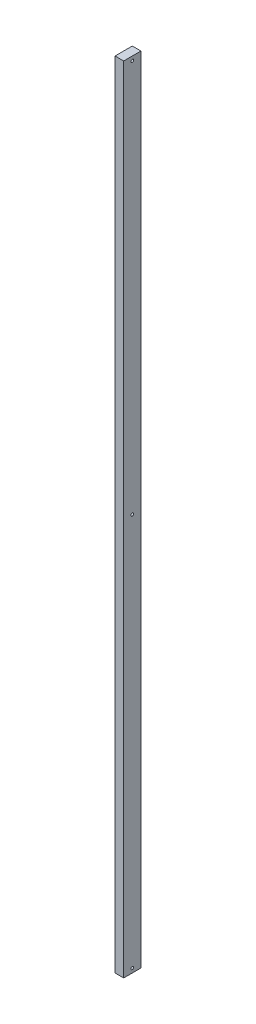
ISO-10303-21;
HEADER;
FILE_DESCRIPTION(('STEP AP214'),'2;1');
FILE_NAME('part.step','',(''),(''),'','','');
FILE_SCHEMA(('AUTOMOTIVE_DESIGN { 1 0 10303 214 1 1 1 1 }'));
ENDSEC;
DATA;
#1=APPLICATION_CONTEXT('core data for automotive mechanical design processes');
#2=APPLICATION_PROTOCOL_DEFINITION('international standard','automotive_design',2000,#1);
#3=PRODUCT_CONTEXT('',#1,'mechanical');
#4=PRODUCT('Part','Part','',(#3));
#5=PRODUCT_RELATED_PRODUCT_CATEGORY('part','',(#4));
#6=PRODUCT_DEFINITION_FORMATION('','',#4);
#7=PRODUCT_DEFINITION_CONTEXT('part definition',#1,'design');
#8=PRODUCT_DEFINITION('design','',#6,#7);
#9=PRODUCT_DEFINITION_SHAPE('','',#8);
#10=(LENGTH_UNIT() NAMED_UNIT(*) SI_UNIT(.MILLI.,.METRE.));
#11=(NAMED_UNIT(*) PLANE_ANGLE_UNIT() SI_UNIT($,.RADIAN.));
#12=(NAMED_UNIT(*) SI_UNIT($,.STERADIAN.) SOLID_ANGLE_UNIT());
#13=UNCERTAINTY_MEASURE_WITH_UNIT(LENGTH_MEASURE(1.E-05),#10,'distance_accuracy_value','');
#14=(GEOMETRIC_REPRESENTATION_CONTEXT(3) GLOBAL_UNCERTAINTY_ASSIGNED_CONTEXT((#13)) GLOBAL_UNIT_ASSIGNED_CONTEXT((#10,
#11,#12)) REPRESENTATION_CONTEXT('',''));
#15=CARTESIAN_POINT('',(0.,0.,0.));
#16=DIRECTION('',(0.,0.,1.));
#17=DIRECTION('',(1.,0.,0.));
#18=AXIS2_PLACEMENT_3D('',#15,#16,#17);
#19=CARTESIAN_POINT('',(-12.5,2300.,-25.));
#20=DIRECTION('',(1.,0.,0.));
#21=DIRECTION('',(0.,0.,-1.));
#22=AXIS2_PLACEMENT_3D('',#19,#20,#21);
#23=PLANE('',#22);
#24=CARTESIAN_POINT('',(-12.5000000000002,12.5,0.));
#25=DIRECTION('',(1.,0.,0.));
#26=DIRECTION('',(0.,0.,-1.));
#27=AXIS2_PLACEMENT_3D('',#24,#25,#26);
#28=CIRCLE('',#27,4.);
#29=CARTESIAN_POINT('',(-12.5000000000002,12.5,-4.));
#30=VERTEX_POINT('',#29);
#31=EDGE_CURVE('E115',#30,#30,#28,.T.);
#32=ORIENTED_EDGE('',*,*,#31,.T.);
#33=EDGE_LOOP('',(#32));
#34=FACE_BOUND('',#33,.T.);
#35=CARTESIAN_POINT('',(-12.5000000000002,2287.5,0.));
#36=DIRECTION('',(1.,0.,0.));
#37=DIRECTION('',(0.,0.,-1.));
#38=AXIS2_PLACEMENT_3D('',#35,#36,#37);
#39=CIRCLE('',#38,4.);
#40=CARTESIAN_POINT('',(-12.5000000000002,2287.5,-4.00000000000001));
#41=VERTEX_POINT('',#40);
#42=EDGE_CURVE('E135',#41,#41,#39,.T.);
#43=ORIENTED_EDGE('',*,*,#42,.T.);
#44=EDGE_LOOP('',(#43));
#45=FACE_BOUND('',#44,.T.);
#46=CARTESIAN_POINT('',(-12.5000000000002,1150.,0.));
#47=DIRECTION('',(1.,0.,0.));
#48=DIRECTION('',(0.,0.,-1.));
#49=AXIS2_PLACEMENT_3D('',#46,#47,#48);
#50=CIRCLE('',#49,4.);
#51=CARTESIAN_POINT('',(-12.5000000000002,1150.,-4.00000000000001));
#52=VERTEX_POINT('',#51);
#53=EDGE_CURVE('E139',#52,#52,#50,.T.);
#54=ORIENTED_EDGE('',*,*,#53,.T.);
#55=EDGE_LOOP('',(#54));
#56=FACE_BOUND('',#55,.T.);
#57=DIRECTION('',(0.,0.,1.));
#58=VECTOR('',#57,1.);
#59=CARTESIAN_POINT('',(-12.5,0.,-25.));
#60=LINE('',#59,#58);
#61=CARTESIAN_POINT('',(-12.5,0.,-25.));
#62=VERTEX_POINT('',#61);
#63=CARTESIAN_POINT('',(-12.5,0.,25.));
#64=VERTEX_POINT('',#63);
#65=EDGE_CURVE('E111',#62,#64,#60,.T.);
#66=ORIENTED_EDGE('',*,*,#65,.T.);
#67=DIRECTION('',(0.,-1.,0.));
#68=VECTOR('',#67,1.);
#69=CARTESIAN_POINT('',(-12.5,2300.,25.));
#70=LINE('',#69,#68);
#71=CARTESIAN_POINT('',(-12.5,2300.,25.));
#72=VERTEX_POINT('',#71);
#73=EDGE_CURVE('E11',#72,#64,#70,.T.);
#74=ORIENTED_EDGE('',*,*,#73,.F.);
#75=DIRECTION('',(0.,0.,1.));
#76=VECTOR('',#75,1.);
#77=CARTESIAN_POINT('',(-12.5,2300.,-25.));
#78=LINE('',#77,#76);
#79=CARTESIAN_POINT('',(-12.5,2300.,-25.));
#80=VERTEX_POINT('',#79);
#81=EDGE_CURVE('E95',#80,#72,#78,.T.);
#82=ORIENTED_EDGE('',*,*,#81,.F.);
#83=DIRECTION('',(0.,-1.,0.));
#84=VECTOR('',#83,1.);
#85=CARTESIAN_POINT('',(-12.5,2300.,-25.));
#86=LINE('',#85,#84);
#87=EDGE_CURVE('E107',#80,#62,#86,.T.);
#88=ORIENTED_EDGE('',*,*,#87,.T.);
#89=EDGE_LOOP('',(#66,#74,#82,#88));
#90=FACE_BOUND('',#89,.T.);
#91=ADVANCED_FACE('F43',(#34,#45,#56,#90),#23,.F.);
#92=CARTESIAN_POINT('',(12.5,2300.,25.));
#93=DIRECTION('',(0.,0.,-1.));
#94=DIRECTION('',(-1.,0.,0.));
#95=AXIS2_PLACEMENT_3D('',#92,#93,#94);
#96=PLANE('',#95);
#97=DIRECTION('',(1.,0.,0.));
#98=VECTOR('',#97,1.);
#99=CARTESIAN_POINT('',(12.5,0.,25.));
#100=LINE('',#99,#98);
#101=CARTESIAN_POINT('',(12.5,0.,25.));
#102=VERTEX_POINT('',#101);
#103=EDGE_CURVE('E100',#64,#102,#100,.T.);
#104=ORIENTED_EDGE('',*,*,#103,.T.);
#105=DIRECTION('',(0.,-1.,0.));
#106=VECTOR('',#105,1.);
#107=CARTESIAN_POINT('',(12.5,2300.,25.));
#108=LINE('',#107,#106);
#109=CARTESIAN_POINT('',(12.5,2300.,25.));
#110=VERTEX_POINT('',#109);
#111=EDGE_CURVE('E52',#110,#102,#108,.T.);
#112=ORIENTED_EDGE('',*,*,#111,.F.);
#113=DIRECTION('',(1.,0.,0.));
#114=VECTOR('',#113,1.);
#115=CARTESIAN_POINT('',(12.5,2300.,25.));
#116=LINE('',#115,#114);
#117=EDGE_CURVE('E90',#72,#110,#116,.T.);
#118=ORIENTED_EDGE('',*,*,#117,.F.);
#119=ORIENTED_EDGE('',*,*,#73,.T.);
#120=EDGE_LOOP('',(#104,#112,#118,#119));
#121=FACE_BOUND('',#120,.T.);
#122=ADVANCED_FACE('F99',(#121),#96,.F.);
#123=CARTESIAN_POINT('',(12.5,2300.,-25.));
#124=DIRECTION('',(-1.,0.,0.));
#125=DIRECTION('',(0.,0.,1.));
#126=AXIS2_PLACEMENT_3D('',#123,#124,#125);
#127=PLANE('',#126);
#128=CARTESIAN_POINT('',(12.5,12.5,0.));
#129=DIRECTION('',(1.,0.,0.));
#130=DIRECTION('',(0.,0.,-1.));
#131=AXIS2_PLACEMENT_3D('',#128,#129,#130);
#132=CIRCLE('',#131,4.);
#133=CARTESIAN_POINT('',(12.5,12.5,-4.));
#134=VERTEX_POINT('',#133);
#135=EDGE_CURVE('E148',#134,#134,#132,.T.);
#136=ORIENTED_EDGE('',*,*,#135,.F.);
#137=EDGE_LOOP('',(#136));
#138=FACE_BOUND('',#137,.T.);
#139=CARTESIAN_POINT('',(12.5,2287.5,0.));
#140=DIRECTION('',(1.,0.,0.));
#141=DIRECTION('',(0.,0.,-1.));
#142=AXIS2_PLACEMENT_3D('',#139,#140,#141);
#143=CIRCLE('',#142,4.);
#144=CARTESIAN_POINT('',(12.5,2287.5,-4.00000000000001));
#145=VERTEX_POINT('',#144);
#146=EDGE_CURVE('E147',#145,#145,#143,.T.);
#147=ORIENTED_EDGE('',*,*,#146,.F.);
#148=EDGE_LOOP('',(#147));
#149=FACE_BOUND('',#148,.T.);
#150=CARTESIAN_POINT('',(12.5,1150.,0.));
#151=DIRECTION('',(1.,0.,0.));
#152=DIRECTION('',(0.,0.,-1.));
#153=AXIS2_PLACEMENT_3D('',#150,#151,#152);
#154=CIRCLE('',#153,4.);
#155=CARTESIAN_POINT('',(12.5,1150.,-4.00000000000001));
#156=VERTEX_POINT('',#155);
#157=EDGE_CURVE('E143',#156,#156,#154,.T.);
#158=ORIENTED_EDGE('',*,*,#157,.F.);
#159=EDGE_LOOP('',(#158));
#160=FACE_BOUND('',#159,.T.);
#161=DIRECTION('',(0.,0.,-1.));
#162=VECTOR('',#161,1.);
#163=CARTESIAN_POINT('',(12.5,0.,-25.));
#164=LINE('',#163,#162);
#165=CARTESIAN_POINT('',(12.5,0.,-25.));
#166=VERTEX_POINT('',#165);
#167=EDGE_CURVE('E77',#102,#166,#164,.T.);
#168=ORIENTED_EDGE('',*,*,#167,.T.);
#169=DIRECTION('',(0.,-1.,0.));
#170=VECTOR('',#169,1.);
#171=CARTESIAN_POINT('',(12.5,2300.,-25.));
#172=LINE('',#171,#170);
#173=CARTESIAN_POINT('',(12.5,2300.,-25.));
#174=VERTEX_POINT('',#173);
#175=EDGE_CURVE('E102',#174,#166,#172,.T.);
#176=ORIENTED_EDGE('',*,*,#175,.F.);
#177=DIRECTION('',(0.,0.,-1.));
#178=VECTOR('',#177,1.);
#179=CARTESIAN_POINT('',(12.5,2300.,-25.));
#180=LINE('',#179,#178);
#181=EDGE_CURVE('E93',#110,#174,#180,.T.);
#182=ORIENTED_EDGE('',*,*,#181,.F.);
#183=ORIENTED_EDGE('',*,*,#111,.T.);
#184=EDGE_LOOP('',(#168,#176,#182,#183));
#185=FACE_BOUND('',#184,.T.);
#186=ADVANCED_FACE('F103',(#138,#149,#160,#185),#127,.F.);
#187=CARTESIAN_POINT('',(12.5,2300.,-25.));
#188=DIRECTION('',(0.,0.,1.));
#189=DIRECTION('',(1.,0.,0.));
#190=AXIS2_PLACEMENT_3D('',#187,#188,#189);
#191=PLANE('',#190);
#192=DIRECTION('',(-1.,0.,0.));
#193=VECTOR('',#192,1.);
#194=CARTESIAN_POINT('',(12.5,0.,-25.));
#195=LINE('',#194,#193);
#196=EDGE_CURVE('E83',#166,#62,#195,.T.);
#197=ORIENTED_EDGE('',*,*,#196,.T.);
#198=ORIENTED_EDGE('',*,*,#87,.F.);
#199=DIRECTION('',(-1.,0.,0.));
#200=VECTOR('',#199,1.);
#201=CARTESIAN_POINT('',(12.5,2300.,-25.));
#202=LINE('',#201,#200);
#203=EDGE_CURVE('E60',#174,#80,#202,.T.);
#204=ORIENTED_EDGE('',*,*,#203,.F.);
#205=ORIENTED_EDGE('',*,*,#175,.T.);
#206=EDGE_LOOP('',(#197,#198,#204,#205));
#207=FACE_BOUND('',#206,.T.);
#208=ADVANCED_FACE('F125',(#207),#191,.F.);
#209=CARTESIAN_POINT('',(0.,2300.,0.));
#210=DIRECTION('',(0.,-1.,0.));
#211=DIRECTION('',(0.,0.,-1.));
#212=AXIS2_PLACEMENT_3D('',#209,#210,#211);
#213=PLANE('',#212);
#214=ORIENTED_EDGE('',*,*,#81,.T.);
#215=ORIENTED_EDGE('',*,*,#117,.T.);
#216=ORIENTED_EDGE('',*,*,#181,.T.);
#217=ORIENTED_EDGE('',*,*,#203,.T.);
#218=EDGE_LOOP('',(#214,#215,#216,#217));
#219=FACE_BOUND('',#218,.T.);
#220=ADVANCED_FACE('F91',(#219),#213,.F.);
#221=CARTESIAN_POINT('',(0.,0.,0.));
#222=DIRECTION('',(0.,-1.,0.));
#223=DIRECTION('',(0.,0.,-1.));
#224=AXIS2_PLACEMENT_3D('',#221,#222,#223);
#225=PLANE('',#224);
#226=ORIENTED_EDGE('',*,*,#65,.F.);
#227=ORIENTED_EDGE('',*,*,#196,.F.);
#228=ORIENTED_EDGE('',*,*,#167,.F.);
#229=ORIENTED_EDGE('',*,*,#103,.F.);
#230=EDGE_LOOP('',(#226,#227,#228,#229));
#231=FACE_BOUND('',#230,.T.);
#232=ADVANCED_FACE('F128',(#231),#225,.T.);
#233=CARTESIAN_POINT('',(-2287.5,1150.,0.));
#234=DIRECTION('',(1.,0.,0.));
#235=DIRECTION('',(0.,0.,-1.));
#236=AXIS2_PLACEMENT_3D('',#233,#234,#235);
#237=CYLINDRICAL_SURFACE('',#236,4.);
#238=ORIENTED_EDGE('',*,*,#157,.T.);
#239=EDGE_LOOP('',(#238));
#240=FACE_BOUND('',#239,.T.);
#241=ORIENTED_EDGE('',*,*,#53,.F.);
#242=EDGE_LOOP('',(#241));
#243=FACE_BOUND('',#242,.T.);
#244=ADVANCED_FACE('F165',(#240,#243),#237,.F.);
#245=CARTESIAN_POINT('',(-2287.5,2287.5,0.));
#246=DIRECTION('',(1.,0.,0.));
#247=DIRECTION('',(0.,0.,-1.));
#248=AXIS2_PLACEMENT_3D('',#245,#246,#247);
#249=CYLINDRICAL_SURFACE('',#248,4.);
#250=ORIENTED_EDGE('',*,*,#146,.T.);
#251=EDGE_LOOP('',(#250));
#252=FACE_BOUND('',#251,.T.);
#253=ORIENTED_EDGE('',*,*,#42,.F.);
#254=EDGE_LOOP('',(#253));
#255=FACE_BOUND('',#254,.T.);
#256=ADVANCED_FACE('F156',(#252,#255),#249,.F.);
#257=CARTESIAN_POINT('',(-2287.5,12.5,0.));
#258=DIRECTION('',(1.,0.,0.));
#259=DIRECTION('',(0.,0.,-1.));
#260=AXIS2_PLACEMENT_3D('',#257,#258,#259);
#261=CYLINDRICAL_SURFACE('',#260,4.);
#262=ORIENTED_EDGE('',*,*,#135,.T.);
#263=EDGE_LOOP('',(#262));
#264=FACE_BOUND('',#263,.T.);
#265=ORIENTED_EDGE('',*,*,#31,.F.);
#266=EDGE_LOOP('',(#265));
#267=FACE_BOUND('',#266,.T.);
#268=ADVANCED_FACE('F180',(#264,#267),#261,.F.);
#269=CLOSED_SHELL('',(#91,#122,#186,#208,#220,#232,#244,#256,#268));
#270=MANIFOLD_SOLID_BREP('B2',#269);
#271=ADVANCED_BREP_SHAPE_REPRESENTATION('',(#18,#270),#14);
#272=SHAPE_DEFINITION_REPRESENTATION(#9,#271);
ENDSEC;
END-ISO-10303-21;
